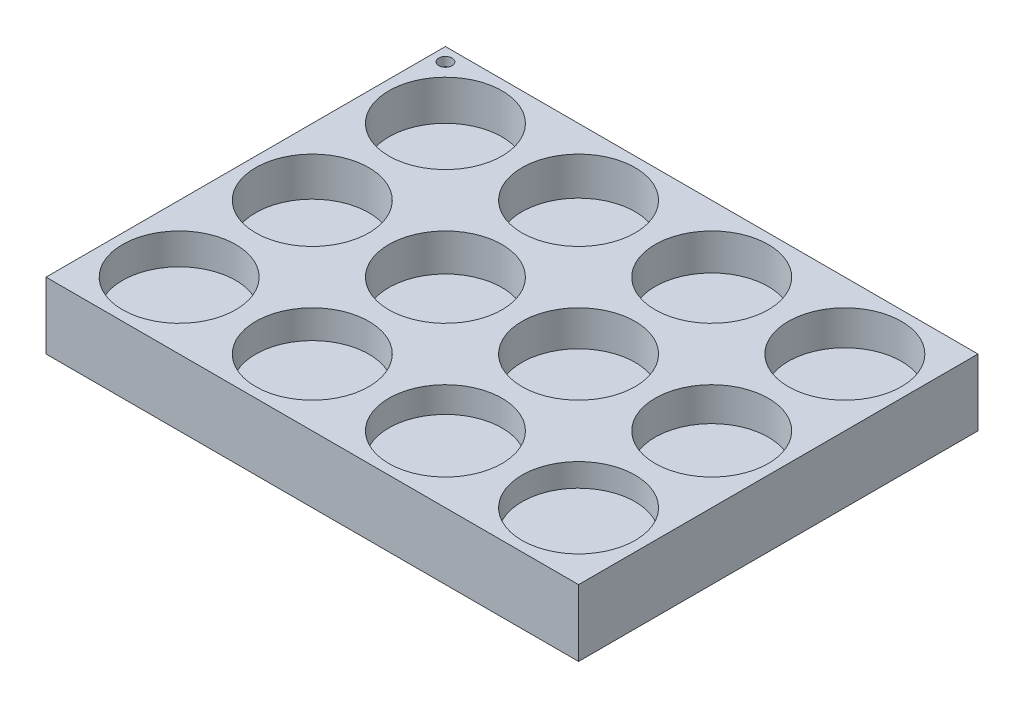
ISO-10303-21;
HEADER;
FILE_DESCRIPTION(('STEP AP214'),'2;1');
FILE_NAME('part.step','',(''),(''),'','','');
FILE_SCHEMA(('AUTOMOTIVE_DESIGN { 1 0 10303 214 1 1 1 1 }'));
ENDSEC;
DATA;
#1=APPLICATION_CONTEXT('core data for automotive mechanical design processes');
#2=APPLICATION_PROTOCOL_DEFINITION('international standard','automotive_design',2000,#1);
#3=PRODUCT_CONTEXT('',#1,'mechanical');
#4=PRODUCT('Part','Part','',(#3));
#5=PRODUCT_RELATED_PRODUCT_CATEGORY('part','',(#4));
#6=PRODUCT_DEFINITION_FORMATION('','',#4);
#7=PRODUCT_DEFINITION_CONTEXT('part definition',#1,'design');
#8=PRODUCT_DEFINITION('design','',#6,#7);
#9=PRODUCT_DEFINITION_SHAPE('','',#8);
#10=(LENGTH_UNIT() NAMED_UNIT(*) SI_UNIT(.MILLI.,.METRE.));
#11=(NAMED_UNIT(*) PLANE_ANGLE_UNIT() SI_UNIT($,.RADIAN.));
#12=(NAMED_UNIT(*) SI_UNIT($,.STERADIAN.) SOLID_ANGLE_UNIT());
#13=UNCERTAINTY_MEASURE_WITH_UNIT(LENGTH_MEASURE(1.E-05),#10,'distance_accuracy_value','');
#14=(GEOMETRIC_REPRESENTATION_CONTEXT(3) GLOBAL_UNCERTAINTY_ASSIGNED_CONTEXT((#13)) GLOBAL_UNIT_ASSIGNED_CONTEXT((#10,
#11,#12)) REPRESENTATION_CONTEXT('',''));
#15=CARTESIAN_POINT('',(0.,0.,0.));
#16=DIRECTION('',(0.,0.,1.));
#17=DIRECTION('',(1.,0.,0.));
#18=AXIS2_PLACEMENT_3D('',#15,#16,#17);
#19=CARTESIAN_POINT('',(0.,0.,0.));
#20=DIRECTION('',(0.,1.,0.));
#21=DIRECTION('',(0.,0.,1.));
#22=AXIS2_PLACEMENT_3D('',#19,#20,#21);
#23=PLANE('',#22);
#24=DIRECTION('',(0.,0.,1.));
#25=VECTOR('',#24,1.);
#26=CARTESIAN_POINT('',(-60.,0.,45.));
#27=LINE('',#26,#25);
#28=CARTESIAN_POINT('',(-60.,0.,-45.));
#29=VERTEX_POINT('',#28);
#30=CARTESIAN_POINT('',(-60.,0.,45.));
#31=VERTEX_POINT('',#30);
#32=EDGE_CURVE('E87',#29,#31,#27,.T.);
#33=ORIENTED_EDGE('',*,*,#32,.F.);
#34=DIRECTION('',(-1.,0.,0.));
#35=VECTOR('',#34,1.);
#36=CARTESIAN_POINT('',(60.,0.,-45.));
#37=LINE('',#36,#35);
#38=CARTESIAN_POINT('',(60.,0.,-45.));
#39=VERTEX_POINT('',#38);
#40=EDGE_CURVE('E56',#39,#29,#37,.T.);
#41=ORIENTED_EDGE('',*,*,#40,.F.);
#42=DIRECTION('',(0.,0.,-1.));
#43=VECTOR('',#42,1.);
#44=CARTESIAN_POINT('',(60.,0.,45.));
#45=LINE('',#44,#43);
#46=CARTESIAN_POINT('',(60.,0.,45.));
#47=VERTEX_POINT('',#46);
#48=EDGE_CURVE('E64',#47,#39,#45,.T.);
#49=ORIENTED_EDGE('',*,*,#48,.F.);
#50=DIRECTION('',(1.,0.,0.));
#51=VECTOR('',#50,1.);
#52=CARTESIAN_POINT('',(60.,0.,45.));
#53=LINE('',#52,#51);
#54=EDGE_CURVE('E183',#31,#47,#53,.T.);
#55=ORIENTED_EDGE('',*,*,#54,.F.);
#56=EDGE_LOOP('',(#33,#41,#49,#55));
#57=FACE_BOUND('',#56,.T.);
#58=CARTESIAN_POINT('',(-45.,0.,-30.));
#59=DIRECTION('',(0.,1.,0.));
#60=DIRECTION('',(0.,0.,1.));
#61=AXIS2_PLACEMENT_3D('',#58,#59,#60);
#62=CIRCLE('',#61,6.65);
#63=CARTESIAN_POINT('',(-45.,0.,-23.35));
#64=VERTEX_POINT('',#63);
#65=EDGE_CURVE('E177',#64,#64,#62,.T.);
#66=ORIENTED_EDGE('',*,*,#65,.T.);
#67=EDGE_LOOP('',(#66));
#68=FACE_BOUND('',#67,.T.);
#69=CARTESIAN_POINT('',(-15.,0.,-30.));
#70=DIRECTION('',(0.,1.,0.));
#71=DIRECTION('',(0.,0.,1.));
#72=AXIS2_PLACEMENT_3D('',#69,#70,#71);
#73=CIRCLE('',#72,6.65);
#74=CARTESIAN_POINT('',(-15.,0.,-23.35));
#75=VERTEX_POINT('',#74);
#76=EDGE_CURVE('E172',#75,#75,#73,.T.);
#77=ORIENTED_EDGE('',*,*,#76,.T.);
#78=EDGE_LOOP('',(#77));
#79=FACE_BOUND('',#78,.T.);
#80=CARTESIAN_POINT('',(15.,0.,-30.));
#81=DIRECTION('',(0.,1.,0.));
#82=DIRECTION('',(0.,0.,1.));
#83=AXIS2_PLACEMENT_3D('',#80,#81,#82);
#84=CIRCLE('',#83,6.65);
#85=CARTESIAN_POINT('',(15.,0.,-23.35));
#86=VERTEX_POINT('',#85);
#87=EDGE_CURVE('E166',#86,#86,#84,.T.);
#88=ORIENTED_EDGE('',*,*,#87,.T.);
#89=EDGE_LOOP('',(#88));
#90=FACE_BOUND('',#89,.T.);
#91=CARTESIAN_POINT('',(45.,0.,-30.));
#92=DIRECTION('',(0.,1.,0.));
#93=DIRECTION('',(0.,0.,1.));
#94=AXIS2_PLACEMENT_3D('',#91,#92,#93);
#95=CIRCLE('',#94,6.65);
#96=CARTESIAN_POINT('',(45.,0.,-23.35));
#97=VERTEX_POINT('',#96);
#98=EDGE_CURVE('E160',#97,#97,#95,.T.);
#99=ORIENTED_EDGE('',*,*,#98,.T.);
#100=EDGE_LOOP('',(#99));
#101=FACE_BOUND('',#100,.T.);
#102=CARTESIAN_POINT('',(-45.,0.,0.));
#103=DIRECTION('',(0.,1.,0.));
#104=DIRECTION('',(0.,0.,1.));
#105=AXIS2_PLACEMENT_3D('',#102,#103,#104);
#106=CIRCLE('',#105,6.65);
#107=CARTESIAN_POINT('',(-45.,0.,6.65000000000001));
#108=VERTEX_POINT('',#107);
#109=EDGE_CURVE('E154',#108,#108,#106,.T.);
#110=ORIENTED_EDGE('',*,*,#109,.T.);
#111=EDGE_LOOP('',(#110));
#112=FACE_BOUND('',#111,.T.);
#113=CARTESIAN_POINT('',(-15.,0.,0.));
#114=DIRECTION('',(0.,1.,0.));
#115=DIRECTION('',(0.,0.,1.));
#116=AXIS2_PLACEMENT_3D('',#113,#114,#115);
#117=CIRCLE('',#116,6.65);
#118=CARTESIAN_POINT('',(-15.,0.,6.65));
#119=VERTEX_POINT('',#118);
#120=EDGE_CURVE('E148',#119,#119,#117,.T.);
#121=ORIENTED_EDGE('',*,*,#120,.T.);
#122=EDGE_LOOP('',(#121));
#123=FACE_BOUND('',#122,.T.);
#124=CARTESIAN_POINT('',(15.,0.,0.));
#125=DIRECTION('',(0.,1.,0.));
#126=DIRECTION('',(0.,0.,1.));
#127=AXIS2_PLACEMENT_3D('',#124,#125,#126);
#128=CIRCLE('',#127,6.65);
#129=CARTESIAN_POINT('',(15.,0.,6.64999999999999));
#130=VERTEX_POINT('',#129);
#131=EDGE_CURVE('E142',#130,#130,#128,.T.);
#132=ORIENTED_EDGE('',*,*,#131,.T.);
#133=EDGE_LOOP('',(#132));
#134=FACE_BOUND('',#133,.T.);
#135=CARTESIAN_POINT('',(45.,0.,0.));
#136=DIRECTION('',(0.,1.,0.));
#137=DIRECTION('',(0.,0.,1.));
#138=AXIS2_PLACEMENT_3D('',#135,#136,#137);
#139=CIRCLE('',#138,6.65);
#140=CARTESIAN_POINT('',(45.,0.,6.65000000000001));
#141=VERTEX_POINT('',#140);
#142=EDGE_CURVE('E136',#141,#141,#139,.T.);
#143=ORIENTED_EDGE('',*,*,#142,.T.);
#144=EDGE_LOOP('',(#143));
#145=FACE_BOUND('',#144,.T.);
#146=CARTESIAN_POINT('',(-45.,0.,30.));
#147=DIRECTION('',(0.,1.,0.));
#148=DIRECTION('',(0.,0.,1.));
#149=AXIS2_PLACEMENT_3D('',#146,#147,#148);
#150=CIRCLE('',#149,6.65);
#151=CARTESIAN_POINT('',(-45.,0.,36.65));
#152=VERTEX_POINT('',#151);
#153=EDGE_CURVE('E130',#152,#152,#150,.T.);
#154=ORIENTED_EDGE('',*,*,#153,.T.);
#155=EDGE_LOOP('',(#154));
#156=FACE_BOUND('',#155,.T.);
#157=CARTESIAN_POINT('',(-15.,0.,30.));
#158=DIRECTION('',(0.,1.,0.));
#159=DIRECTION('',(0.,0.,1.));
#160=AXIS2_PLACEMENT_3D('',#157,#158,#159);
#161=CIRCLE('',#160,6.65);
#162=CARTESIAN_POINT('',(-15.,0.,36.65));
#163=VERTEX_POINT('',#162);
#164=EDGE_CURVE('E124',#163,#163,#161,.T.);
#165=ORIENTED_EDGE('',*,*,#164,.T.);
#166=EDGE_LOOP('',(#165));
#167=FACE_BOUND('',#166,.T.);
#168=CARTESIAN_POINT('',(15.,0.,30.));
#169=DIRECTION('',(0.,1.,0.));
#170=DIRECTION('',(0.,0.,1.));
#171=AXIS2_PLACEMENT_3D('',#168,#169,#170);
#172=CIRCLE('',#171,6.65);
#173=CARTESIAN_POINT('',(15.,0.,36.65));
#174=VERTEX_POINT('',#173);
#175=EDGE_CURVE('E117',#174,#174,#172,.T.);
#176=ORIENTED_EDGE('',*,*,#175,.T.);
#177=EDGE_LOOP('',(#176));
#178=FACE_BOUND('',#177,.T.);
#179=CARTESIAN_POINT('',(45.,0.,30.));
#180=DIRECTION('',(0.,1.,0.));
#181=DIRECTION('',(0.,0.,1.));
#182=AXIS2_PLACEMENT_3D('',#179,#180,#181);
#183=CIRCLE('',#182,6.65);
#184=CARTESIAN_POINT('',(45.,0.,36.65));
#185=VERTEX_POINT('',#184);
#186=EDGE_CURVE('E114',#185,#185,#183,.T.);
#187=ORIENTED_EDGE('',*,*,#186,.T.);
#188=EDGE_LOOP('',(#187));
#189=FACE_BOUND('',#188,.T.);
#190=ADVANCED_FACE('F41',(#57,#68,#79,#90,#101,#112,#123,#134,#145,#156,#167,#178,#189),#23,.F.);
#191=CARTESIAN_POINT('',(-60.,5.,45.));
#192=DIRECTION('',(1.,0.,0.));
#193=DIRECTION('',(0.,0.,-1.));
#194=AXIS2_PLACEMENT_3D('',#191,#192,#193);
#195=PLANE('',#194);
#196=ORIENTED_EDGE('',*,*,#32,.T.);
#197=DIRECTION('',(0.,-1.,0.));
#198=VECTOR('',#197,1.);
#199=CARTESIAN_POINT('',(-60.,5.,45.));
#200=LINE('',#199,#198);
#201=CARTESIAN_POINT('',(-60.,15.,45.));
#202=VERTEX_POINT('',#201);
#203=EDGE_CURVE('E12',#202,#31,#200,.T.);
#204=ORIENTED_EDGE('',*,*,#203,.F.);
#205=DIRECTION('',(0.,0.,1.));
#206=VECTOR('',#205,1.);
#207=CARTESIAN_POINT('',(-60.,15.,-45.));
#208=LINE('',#207,#206);
#209=CARTESIAN_POINT('',(-60.,15.,-45.));
#210=VERTEX_POINT('',#209);
#211=EDGE_CURVE('E85',#210,#202,#208,.T.);
#212=ORIENTED_EDGE('',*,*,#211,.F.);
#213=DIRECTION('',(0.,-1.,0.));
#214=VECTOR('',#213,1.);
#215=CARTESIAN_POINT('',(-60.,5.,-45.));
#216=LINE('',#215,#214);
#217=EDGE_CURVE('E187',#210,#29,#216,.T.);
#218=ORIENTED_EDGE('',*,*,#217,.T.);
#219=EDGE_LOOP('',(#196,#204,#212,#218));
#220=FACE_BOUND('',#219,.T.);
#221=ADVANCED_FACE('F43',(#220),#195,.F.);
#222=CARTESIAN_POINT('',(60.,5.,45.));
#223=DIRECTION('',(0.,0.,-1.));
#224=DIRECTION('',(-1.,0.,0.));
#225=AXIS2_PLACEMENT_3D('',#222,#223,#224);
#226=PLANE('',#225);
#227=ORIENTED_EDGE('',*,*,#54,.T.);
#228=DIRECTION('',(0.,-1.,0.));
#229=VECTOR('',#228,1.);
#230=CARTESIAN_POINT('',(60.,5.,45.));
#231=LINE('',#230,#229);
#232=CARTESIAN_POINT('',(60.,15.,45.));
#233=VERTEX_POINT('',#232);
#234=EDGE_CURVE('E49',#233,#47,#231,.T.);
#235=ORIENTED_EDGE('',*,*,#234,.F.);
#236=DIRECTION('',(1.,0.,0.));
#237=VECTOR('',#236,1.);
#238=CARTESIAN_POINT('',(-60.,15.,45.));
#239=LINE('',#238,#237);
#240=EDGE_CURVE('E90',#202,#233,#239,.T.);
#241=ORIENTED_EDGE('',*,*,#240,.F.);
#242=ORIENTED_EDGE('',*,*,#203,.T.);
#243=EDGE_LOOP('',(#227,#235,#241,#242));
#244=FACE_BOUND('',#243,.T.);
#245=ADVANCED_FACE('F91',(#244),#226,.F.);
#246=CARTESIAN_POINT('',(60.,5.,45.));
#247=DIRECTION('',(-1.,0.,0.));
#248=DIRECTION('',(0.,0.,1.));
#249=AXIS2_PLACEMENT_3D('',#246,#247,#248);
#250=PLANE('',#249);
#251=ORIENTED_EDGE('',*,*,#48,.T.);
#252=DIRECTION('',(0.,-1.,0.));
#253=VECTOR('',#252,1.);
#254=CARTESIAN_POINT('',(60.,5.,-45.));
#255=LINE('',#254,#253);
#256=CARTESIAN_POINT('',(60.,15.,-45.));
#257=VERTEX_POINT('',#256);
#258=EDGE_CURVE('E189',#257,#39,#255,.T.);
#259=ORIENTED_EDGE('',*,*,#258,.F.);
#260=DIRECTION('',(0.,0.,-1.));
#261=VECTOR('',#260,1.);
#262=CARTESIAN_POINT('',(60.,15.,-45.));
#263=LINE('',#262,#261);
#264=EDGE_CURVE('E95',#233,#257,#263,.T.);
#265=ORIENTED_EDGE('',*,*,#264,.F.);
#266=ORIENTED_EDGE('',*,*,#234,.T.);
#267=EDGE_LOOP('',(#251,#259,#265,#266));
#268=FACE_BOUND('',#267,.T.);
#269=ADVANCED_FACE('F190',(#268),#250,.F.);
#270=CARTESIAN_POINT('',(60.,5.,-45.));
#271=DIRECTION('',(0.,0.,1.));
#272=DIRECTION('',(1.,0.,0.));
#273=AXIS2_PLACEMENT_3D('',#270,#271,#272);
#274=PLANE('',#273);
#275=ORIENTED_EDGE('',*,*,#40,.T.);
#276=ORIENTED_EDGE('',*,*,#217,.F.);
#277=DIRECTION('',(-1.,0.,0.));
#278=VECTOR('',#277,1.);
#279=CARTESIAN_POINT('',(-60.,15.,-45.));
#280=LINE('',#279,#278);
#281=EDGE_CURVE('E100',#257,#210,#280,.T.);
#282=ORIENTED_EDGE('',*,*,#281,.F.);
#283=ORIENTED_EDGE('',*,*,#258,.T.);
#284=EDGE_LOOP('',(#275,#276,#282,#283));
#285=FACE_BOUND('',#284,.T.);
#286=ADVANCED_FACE('F275',(#285),#274,.F.);
#287=CARTESIAN_POINT('',(-45.,5.,-30.));
#288=DIRECTION('',(0.,-1.,0.));
#289=DIRECTION('',(0.,0.,-1.));
#290=AXIS2_PLACEMENT_3D('',#287,#288,#289);
#291=CYLINDRICAL_SURFACE('',#290,6.65);
#292=CARTESIAN_POINT('',(-45.,5.,-30.));
#293=DIRECTION('',(0.,1.,0.));
#294=DIRECTION('',(0.,0.,1.));
#295=AXIS2_PLACEMENT_3D('',#292,#293,#294);
#296=CIRCLE('',#295,6.65);
#297=CARTESIAN_POINT('',(-45.,5.,-23.35));
#298=VERTEX_POINT('',#297);
#299=EDGE_CURVE('E169',#298,#298,#296,.T.);
#300=ORIENTED_EDGE('',*,*,#299,.T.);
#301=EDGE_LOOP('',(#300));
#302=FACE_BOUND('',#301,.T.);
#303=ORIENTED_EDGE('',*,*,#65,.F.);
#304=EDGE_LOOP('',(#303));
#305=FACE_BOUND('',#304,.T.);
#306=ADVANCED_FACE('F272',(#302,#305),#291,.F.);
#307=CARTESIAN_POINT('',(-15.,5.,-30.));
#308=DIRECTION('',(0.,-1.,0.));
#309=DIRECTION('',(0.,0.,-1.));
#310=AXIS2_PLACEMENT_3D('',#307,#308,#309);
#311=CYLINDRICAL_SURFACE('',#310,6.65);
#312=CARTESIAN_POINT('',(-15.,5.,-30.));
#313=DIRECTION('',(0.,1.,0.));
#314=DIRECTION('',(0.,0.,1.));
#315=AXIS2_PLACEMENT_3D('',#312,#313,#314);
#316=CIRCLE('',#315,6.65);
#317=CARTESIAN_POINT('',(-15.,5.,-23.35));
#318=VERTEX_POINT('',#317);
#319=EDGE_CURVE('E163',#318,#318,#316,.T.);
#320=ORIENTED_EDGE('',*,*,#319,.T.);
#321=EDGE_LOOP('',(#320));
#322=FACE_BOUND('',#321,.T.);
#323=ORIENTED_EDGE('',*,*,#76,.F.);
#324=EDGE_LOOP('',(#323));
#325=FACE_BOUND('',#324,.T.);
#326=ADVANCED_FACE('F268',(#322,#325),#311,.F.);
#327=CARTESIAN_POINT('',(15.,5.,-30.));
#328=DIRECTION('',(0.,-1.,0.));
#329=DIRECTION('',(0.,0.,-1.));
#330=AXIS2_PLACEMENT_3D('',#327,#328,#329);
#331=CYLINDRICAL_SURFACE('',#330,6.65);
#332=CARTESIAN_POINT('',(15.,5.,-30.));
#333=DIRECTION('',(0.,1.,0.));
#334=DIRECTION('',(0.,0.,1.));
#335=AXIS2_PLACEMENT_3D('',#332,#333,#334);
#336=CIRCLE('',#335,6.65);
#337=CARTESIAN_POINT('',(15.,5.,-23.35));
#338=VERTEX_POINT('',#337);
#339=EDGE_CURVE('E157',#338,#338,#336,.T.);
#340=ORIENTED_EDGE('',*,*,#339,.T.);
#341=EDGE_LOOP('',(#340));
#342=FACE_BOUND('',#341,.T.);
#343=ORIENTED_EDGE('',*,*,#87,.F.);
#344=EDGE_LOOP('',(#343));
#345=FACE_BOUND('',#344,.T.);
#346=ADVANCED_FACE('F264',(#342,#345),#331,.F.);
#347=CARTESIAN_POINT('',(45.,5.,-30.));
#348=DIRECTION('',(0.,-1.,0.));
#349=DIRECTION('',(0.,0.,-1.));
#350=AXIS2_PLACEMENT_3D('',#347,#348,#349);
#351=CYLINDRICAL_SURFACE('',#350,6.65);
#352=CARTESIAN_POINT('',(45.,5.,-30.));
#353=DIRECTION('',(0.,1.,0.));
#354=DIRECTION('',(0.,0.,1.));
#355=AXIS2_PLACEMENT_3D('',#352,#353,#354);
#356=CIRCLE('',#355,6.65);
#357=CARTESIAN_POINT('',(45.,5.,-23.35));
#358=VERTEX_POINT('',#357);
#359=EDGE_CURVE('E151',#358,#358,#356,.T.);
#360=ORIENTED_EDGE('',*,*,#359,.T.);
#361=EDGE_LOOP('',(#360));
#362=FACE_BOUND('',#361,.T.);
#363=ORIENTED_EDGE('',*,*,#98,.F.);
#364=EDGE_LOOP('',(#363));
#365=FACE_BOUND('',#364,.T.);
#366=ADVANCED_FACE('F260',(#362,#365),#351,.F.);
#367=CARTESIAN_POINT('',(-45.,5.,0.));
#368=DIRECTION('',(0.,-1.,0.));
#369=DIRECTION('',(0.,0.,-1.));
#370=AXIS2_PLACEMENT_3D('',#367,#368,#369);
#371=CYLINDRICAL_SURFACE('',#370,6.65);
#372=CARTESIAN_POINT('',(-45.,5.,0.));
#373=DIRECTION('',(0.,1.,0.));
#374=DIRECTION('',(0.,0.,1.));
#375=AXIS2_PLACEMENT_3D('',#372,#373,#374);
#376=CIRCLE('',#375,6.65);
#377=CARTESIAN_POINT('',(-45.,5.,6.65000000000001));
#378=VERTEX_POINT('',#377);
#379=EDGE_CURVE('E145',#378,#378,#376,.T.);
#380=ORIENTED_EDGE('',*,*,#379,.T.);
#381=EDGE_LOOP('',(#380));
#382=FACE_BOUND('',#381,.T.);
#383=ORIENTED_EDGE('',*,*,#109,.F.);
#384=EDGE_LOOP('',(#383));
#385=FACE_BOUND('',#384,.T.);
#386=ADVANCED_FACE('F256',(#382,#385),#371,.F.);
#387=CARTESIAN_POINT('',(-15.,5.,0.));
#388=DIRECTION('',(0.,-1.,0.));
#389=DIRECTION('',(0.,0.,-1.));
#390=AXIS2_PLACEMENT_3D('',#387,#388,#389);
#391=CYLINDRICAL_SURFACE('',#390,6.65);
#392=CARTESIAN_POINT('',(-15.,5.,0.));
#393=DIRECTION('',(0.,1.,0.));
#394=DIRECTION('',(0.,0.,1.));
#395=AXIS2_PLACEMENT_3D('',#392,#393,#394);
#396=CIRCLE('',#395,6.65);
#397=CARTESIAN_POINT('',(-15.,5.,6.65));
#398=VERTEX_POINT('',#397);
#399=EDGE_CURVE('E139',#398,#398,#396,.T.);
#400=ORIENTED_EDGE('',*,*,#399,.T.);
#401=EDGE_LOOP('',(#400));
#402=FACE_BOUND('',#401,.T.);
#403=ORIENTED_EDGE('',*,*,#120,.F.);
#404=EDGE_LOOP('',(#403));
#405=FACE_BOUND('',#404,.T.);
#406=ADVANCED_FACE('F252',(#402,#405),#391,.F.);
#407=CARTESIAN_POINT('',(15.,5.,0.));
#408=DIRECTION('',(0.,-1.,0.));
#409=DIRECTION('',(0.,0.,-1.));
#410=AXIS2_PLACEMENT_3D('',#407,#408,#409);
#411=CYLINDRICAL_SURFACE('',#410,6.65);
#412=CARTESIAN_POINT('',(15.,5.,0.));
#413=DIRECTION('',(0.,1.,0.));
#414=DIRECTION('',(0.,0.,1.));
#415=AXIS2_PLACEMENT_3D('',#412,#413,#414);
#416=CIRCLE('',#415,6.65);
#417=CARTESIAN_POINT('',(15.,5.,6.64999999999999));
#418=VERTEX_POINT('',#417);
#419=EDGE_CURVE('E133',#418,#418,#416,.T.);
#420=ORIENTED_EDGE('',*,*,#419,.T.);
#421=EDGE_LOOP('',(#420));
#422=FACE_BOUND('',#421,.T.);
#423=ORIENTED_EDGE('',*,*,#131,.F.);
#424=EDGE_LOOP('',(#423));
#425=FACE_BOUND('',#424,.T.);
#426=ADVANCED_FACE('F248',(#422,#425),#411,.F.);
#427=CARTESIAN_POINT('',(45.,5.,0.));
#428=DIRECTION('',(0.,-1.,0.));
#429=DIRECTION('',(0.,0.,-1.));
#430=AXIS2_PLACEMENT_3D('',#427,#428,#429);
#431=CYLINDRICAL_SURFACE('',#430,6.65);
#432=CARTESIAN_POINT('',(45.,5.,0.));
#433=DIRECTION('',(0.,1.,0.));
#434=DIRECTION('',(0.,0.,1.));
#435=AXIS2_PLACEMENT_3D('',#432,#433,#434);
#436=CIRCLE('',#435,6.65);
#437=CARTESIAN_POINT('',(45.,5.,6.65000000000001));
#438=VERTEX_POINT('',#437);
#439=EDGE_CURVE('E127',#438,#438,#436,.T.);
#440=ORIENTED_EDGE('',*,*,#439,.T.);
#441=EDGE_LOOP('',(#440));
#442=FACE_BOUND('',#441,.T.);
#443=ORIENTED_EDGE('',*,*,#142,.F.);
#444=EDGE_LOOP('',(#443));
#445=FACE_BOUND('',#444,.T.);
#446=ADVANCED_FACE('F244',(#442,#445),#431,.F.);
#447=CARTESIAN_POINT('',(-45.,5.,30.));
#448=DIRECTION('',(0.,-1.,0.));
#449=DIRECTION('',(0.,0.,-1.));
#450=AXIS2_PLACEMENT_3D('',#447,#448,#449);
#451=CYLINDRICAL_SURFACE('',#450,6.65);
#452=CARTESIAN_POINT('',(-45.,5.,30.));
#453=DIRECTION('',(0.,1.,0.));
#454=DIRECTION('',(0.,0.,1.));
#455=AXIS2_PLACEMENT_3D('',#452,#453,#454);
#456=CIRCLE('',#455,6.65);
#457=CARTESIAN_POINT('',(-45.,5.,36.65));
#458=VERTEX_POINT('',#457);
#459=EDGE_CURVE('E121',#458,#458,#456,.T.);
#460=ORIENTED_EDGE('',*,*,#459,.T.);
#461=EDGE_LOOP('',(#460));
#462=FACE_BOUND('',#461,.T.);
#463=ORIENTED_EDGE('',*,*,#153,.F.);
#464=EDGE_LOOP('',(#463));
#465=FACE_BOUND('',#464,.T.);
#466=ADVANCED_FACE('F240',(#462,#465),#451,.F.);
#467=CARTESIAN_POINT('',(-15.,5.,30.));
#468=DIRECTION('',(0.,-1.,0.));
#469=DIRECTION('',(0.,0.,-1.));
#470=AXIS2_PLACEMENT_3D('',#467,#468,#469);
#471=CYLINDRICAL_SURFACE('',#470,6.65);
#472=CARTESIAN_POINT('',(-15.,5.,30.));
#473=DIRECTION('',(0.,1.,0.));
#474=DIRECTION('',(0.,0.,1.));
#475=AXIS2_PLACEMENT_3D('',#472,#473,#474);
#476=CIRCLE('',#475,6.65);
#477=CARTESIAN_POINT('',(-15.,5.,36.65));
#478=VERTEX_POINT('',#477);
#479=EDGE_CURVE('E113',#478,#478,#476,.T.);
#480=ORIENTED_EDGE('',*,*,#479,.T.);
#481=EDGE_LOOP('',(#480));
#482=FACE_BOUND('',#481,.T.);
#483=ORIENTED_EDGE('',*,*,#164,.F.);
#484=EDGE_LOOP('',(#483));
#485=FACE_BOUND('',#484,.T.);
#486=ADVANCED_FACE('F233',(#482,#485),#471,.F.);
#487=CARTESIAN_POINT('',(15.,5.,30.));
#488=DIRECTION('',(0.,-1.,0.));
#489=DIRECTION('',(0.,0.,-1.));
#490=AXIS2_PLACEMENT_3D('',#487,#488,#489);
#491=CYLINDRICAL_SURFACE('',#490,6.65);
#492=CARTESIAN_POINT('',(15.,5.,30.));
#493=DIRECTION('',(0.,1.,0.));
#494=DIRECTION('',(0.,0.,1.));
#495=AXIS2_PLACEMENT_3D('',#492,#493,#494);
#496=CIRCLE('',#495,6.65);
#497=CARTESIAN_POINT('',(15.,5.,36.65));
#498=VERTEX_POINT('',#497);
#499=EDGE_CURVE('E118',#498,#498,#496,.T.);
#500=ORIENTED_EDGE('',*,*,#499,.T.);
#501=EDGE_LOOP('',(#500));
#502=FACE_BOUND('',#501,.T.);
#503=ORIENTED_EDGE('',*,*,#175,.F.);
#504=EDGE_LOOP('',(#503));
#505=FACE_BOUND('',#504,.T.);
#506=ADVANCED_FACE('F222',(#502,#505),#491,.F.);
#507=CARTESIAN_POINT('',(45.,5.,30.));
#508=DIRECTION('',(0.,-1.,0.));
#509=DIRECTION('',(0.,0.,-1.));
#510=AXIS2_PLACEMENT_3D('',#507,#508,#509);
#511=CYLINDRICAL_SURFACE('',#510,6.65);
#512=CARTESIAN_POINT('',(45.,5.,30.));
#513=DIRECTION('',(0.,1.,0.));
#514=DIRECTION('',(0.,0.,1.));
#515=AXIS2_PLACEMENT_3D('',#512,#513,#514);
#516=CIRCLE('',#515,6.65);
#517=CARTESIAN_POINT('',(45.,5.,36.65));
#518=VERTEX_POINT('',#517);
#519=EDGE_CURVE('E110',#518,#518,#516,.T.);
#520=ORIENTED_EDGE('',*,*,#519,.T.);
#521=EDGE_LOOP('',(#520));
#522=FACE_BOUND('',#521,.T.);
#523=ORIENTED_EDGE('',*,*,#186,.F.);
#524=EDGE_LOOP('',(#523));
#525=FACE_BOUND('',#524,.T.);
#526=ADVANCED_FACE('F219',(#522,#525),#511,.F.);
#527=CARTESIAN_POINT('',(0.,5.,0.));
#528=DIRECTION('',(0.,1.,0.));
#529=DIRECTION('',(0.,0.,1.));
#530=AXIS2_PLACEMENT_3D('',#527,#528,#529);
#531=PLANE('',#530);
#532=ORIENTED_EDGE('',*,*,#519,.F.);
#533=EDGE_LOOP('',(#532));
#534=FACE_BOUND('',#533,.T.);
#535=ADVANCED_FACE('F221',(#534),#531,.F.);
#536=ORIENTED_EDGE('',*,*,#479,.F.);
#537=EDGE_LOOP('',(#536));
#538=FACE_BOUND('',#537,.T.);
#539=ADVANCED_FACE('F229',(#538),#531,.F.);
#540=ORIENTED_EDGE('',*,*,#439,.F.);
#541=EDGE_LOOP('',(#540));
#542=FACE_BOUND('',#541,.T.);
#543=ADVANCED_FACE('F425',(#542),#531,.F.);
#544=ORIENTED_EDGE('',*,*,#399,.F.);
#545=EDGE_LOOP('',(#544));
#546=FACE_BOUND('',#545,.T.);
#547=ADVANCED_FACE('F435',(#546),#531,.F.);
#548=ORIENTED_EDGE('',*,*,#359,.F.);
#549=EDGE_LOOP('',(#548));
#550=FACE_BOUND('',#549,.T.);
#551=ADVANCED_FACE('F445',(#550),#531,.F.);
#552=ORIENTED_EDGE('',*,*,#319,.F.);
#553=EDGE_LOOP('',(#552));
#554=FACE_BOUND('',#553,.T.);
#555=ADVANCED_FACE('F455',(#554),#531,.F.);
#556=ORIENTED_EDGE('',*,*,#299,.F.);
#557=EDGE_LOOP('',(#556));
#558=FACE_BOUND('',#557,.T.);
#559=ADVANCED_FACE('F465',(#558),#531,.F.);
#560=ORIENTED_EDGE('',*,*,#339,.F.);
#561=EDGE_LOOP('',(#560));
#562=FACE_BOUND('',#561,.T.);
#563=ADVANCED_FACE('F475',(#562),#531,.F.);
#564=ORIENTED_EDGE('',*,*,#379,.F.);
#565=EDGE_LOOP('',(#564));
#566=FACE_BOUND('',#565,.T.);
#567=ADVANCED_FACE('F485',(#566),#531,.F.);
#568=ORIENTED_EDGE('',*,*,#419,.F.);
#569=EDGE_LOOP('',(#568));
#570=FACE_BOUND('',#569,.T.);
#571=ADVANCED_FACE('F495',(#570),#531,.F.);
#572=ORIENTED_EDGE('',*,*,#459,.F.);
#573=EDGE_LOOP('',(#572));
#574=FACE_BOUND('',#573,.T.);
#575=ADVANCED_FACE('F505',(#574),#531,.F.);
#576=ORIENTED_EDGE('',*,*,#499,.F.);
#577=EDGE_LOOP('',(#576));
#578=FACE_BOUND('',#577,.T.);
#579=ADVANCED_FACE('F232',(#578),#531,.F.);
#580=CARTESIAN_POINT('',(0.,15.,0.));
#581=DIRECTION('',(0.,1.,0.));
#582=DIRECTION('',(0.,0.,1.));
#583=AXIS2_PLACEMENT_3D('',#580,#581,#582);
#584=PLANE('',#583);
#585=CARTESIAN_POINT('',(-57.0078057300643,15.,-42.0078057300642));
#586=DIRECTION('',(0.,1.,0.));
#587=DIRECTION('',(0.,0.,1.));
#588=AXIS2_PLACEMENT_3D('',#585,#586,#587);
#589=CIRCLE('',#588,1.5);
#590=CARTESIAN_POINT('',(-57.0078057300643,15.,-40.5078057300642));
#591=VERTEX_POINT('',#590);
#592=EDGE_CURVE('E864',#591,#591,#589,.T.);
#593=ORIENTED_EDGE('',*,*,#592,.F.);
#594=EDGE_LOOP('',(#593));
#595=FACE_BOUND('',#594,.T.);
#596=CARTESIAN_POINT('',(45.,15.,30.));
#597=DIRECTION('',(0.,1.,0.));
#598=DIRECTION('',(0.,0.,1.));
#599=AXIS2_PLACEMENT_3D('',#596,#597,#598);
#600=CIRCLE('',#599,12.75);
#601=CARTESIAN_POINT('',(45.,15.,42.75));
#602=VERTEX_POINT('',#601);
#603=EDGE_CURVE('E863',#602,#602,#600,.T.);
#604=ORIENTED_EDGE('',*,*,#603,.F.);
#605=EDGE_LOOP('',(#604));
#606=FACE_BOUND('',#605,.T.);
#607=CARTESIAN_POINT('',(45.,15.,0.));
#608=DIRECTION('',(0.,1.,0.));
#609=DIRECTION('',(0.,0.,1.));
#610=AXIS2_PLACEMENT_3D('',#607,#608,#609);
#611=CIRCLE('',#610,12.75);
#612=CARTESIAN_POINT('',(45.,15.,12.75));
#613=VERTEX_POINT('',#612);
#614=EDGE_CURVE('E874',#613,#613,#611,.T.);
#615=ORIENTED_EDGE('',*,*,#614,.F.);
#616=EDGE_LOOP('',(#615));
#617=FACE_BOUND('',#616,.T.);
#618=CARTESIAN_POINT('',(45.,15.,-30.));
#619=DIRECTION('',(0.,1.,0.));
#620=DIRECTION('',(0.,0.,1.));
#621=AXIS2_PLACEMENT_3D('',#618,#619,#620);
#622=CIRCLE('',#621,12.75);
#623=CARTESIAN_POINT('',(45.,15.,-17.25));
#624=VERTEX_POINT('',#623);
#625=EDGE_CURVE('E880',#624,#624,#622,.T.);
#626=ORIENTED_EDGE('',*,*,#625,.F.);
#627=EDGE_LOOP('',(#626));
#628=FACE_BOUND('',#627,.T.);
#629=CARTESIAN_POINT('',(15.,15.,30.));
#630=DIRECTION('',(0.,1.,0.));
#631=DIRECTION('',(0.,0.,1.));
#632=AXIS2_PLACEMENT_3D('',#629,#630,#631);
#633=CIRCLE('',#632,12.75);
#634=CARTESIAN_POINT('',(15.,15.,42.75));
#635=VERTEX_POINT('',#634);
#636=EDGE_CURVE('E886',#635,#635,#633,.T.);
#637=ORIENTED_EDGE('',*,*,#636,.F.);
#638=EDGE_LOOP('',(#637));
#639=FACE_BOUND('',#638,.T.);
#640=CARTESIAN_POINT('',(15.,15.,0.));
#641=DIRECTION('',(0.,1.,0.));
#642=DIRECTION('',(0.,0.,1.));
#643=AXIS2_PLACEMENT_3D('',#640,#641,#642);
#644=CIRCLE('',#643,12.75);
#645=CARTESIAN_POINT('',(15.,15.,12.75));
#646=VERTEX_POINT('',#645);
#647=EDGE_CURVE('E892',#646,#646,#644,.T.);
#648=ORIENTED_EDGE('',*,*,#647,.F.);
#649=EDGE_LOOP('',(#648));
#650=FACE_BOUND('',#649,.T.);
#651=CARTESIAN_POINT('',(15.,15.,-30.));
#652=DIRECTION('',(0.,1.,0.));
#653=DIRECTION('',(0.,0.,1.));
#654=AXIS2_PLACEMENT_3D('',#651,#652,#653);
#655=CIRCLE('',#654,12.75);
#656=CARTESIAN_POINT('',(15.,15.,-17.25));
#657=VERTEX_POINT('',#656);
#658=EDGE_CURVE('E898',#657,#657,#655,.T.);
#659=ORIENTED_EDGE('',*,*,#658,.F.);
#660=EDGE_LOOP('',(#659));
#661=FACE_BOUND('',#660,.T.);
#662=CARTESIAN_POINT('',(-15.,15.,30.));
#663=DIRECTION('',(0.,1.,0.));
#664=DIRECTION('',(0.,0.,1.));
#665=AXIS2_PLACEMENT_3D('',#662,#663,#664);
#666=CIRCLE('',#665,12.75);
#667=CARTESIAN_POINT('',(-15.,15.,42.75));
#668=VERTEX_POINT('',#667);
#669=EDGE_CURVE('E904',#668,#668,#666,.T.);
#670=ORIENTED_EDGE('',*,*,#669,.F.);
#671=EDGE_LOOP('',(#670));
#672=FACE_BOUND('',#671,.T.);
#673=CARTESIAN_POINT('',(-15.,15.,0.));
#674=DIRECTION('',(0.,1.,0.));
#675=DIRECTION('',(0.,0.,1.));
#676=AXIS2_PLACEMENT_3D('',#673,#674,#675);
#677=CIRCLE('',#676,12.75);
#678=CARTESIAN_POINT('',(-15.,15.,12.75));
#679=VERTEX_POINT('',#678);
#680=EDGE_CURVE('E910',#679,#679,#677,.T.);
#681=ORIENTED_EDGE('',*,*,#680,.F.);
#682=EDGE_LOOP('',(#681));
#683=FACE_BOUND('',#682,.T.);
#684=CARTESIAN_POINT('',(-15.,15.,-30.));
#685=DIRECTION('',(0.,1.,0.));
#686=DIRECTION('',(0.,0.,1.));
#687=AXIS2_PLACEMENT_3D('',#684,#685,#686);
#688=CIRCLE('',#687,12.75);
#689=CARTESIAN_POINT('',(-15.,15.,-17.25));
#690=VERTEX_POINT('',#689);
#691=EDGE_CURVE('E916',#690,#690,#688,.T.);
#692=ORIENTED_EDGE('',*,*,#691,.F.);
#693=EDGE_LOOP('',(#692));
#694=FACE_BOUND('',#693,.T.);
#695=CARTESIAN_POINT('',(-45.,15.,30.));
#696=DIRECTION('',(0.,1.,0.));
#697=DIRECTION('',(0.,0.,1.));
#698=AXIS2_PLACEMENT_3D('',#695,#696,#697);
#699=CIRCLE('',#698,12.75);
#700=CARTESIAN_POINT('',(-45.,15.,42.75));
#701=VERTEX_POINT('',#700);
#702=EDGE_CURVE('E922',#701,#701,#699,.T.);
#703=ORIENTED_EDGE('',*,*,#702,.F.);
#704=EDGE_LOOP('',(#703));
#705=FACE_BOUND('',#704,.T.);
#706=CARTESIAN_POINT('',(-45.,15.,0.));
#707=DIRECTION('',(0.,1.,0.));
#708=DIRECTION('',(0.,0.,1.));
#709=AXIS2_PLACEMENT_3D('',#706,#707,#708);
#710=CIRCLE('',#709,12.75);
#711=CARTESIAN_POINT('',(-45.,15.,12.75));
#712=VERTEX_POINT('',#711);
#713=EDGE_CURVE('E928',#712,#712,#710,.T.);
#714=ORIENTED_EDGE('',*,*,#713,.F.);
#715=EDGE_LOOP('',(#714));
#716=FACE_BOUND('',#715,.T.);
#717=CARTESIAN_POINT('',(-45.,15.,-30.));
#718=DIRECTION('',(0.,1.,0.));
#719=DIRECTION('',(0.,0.,1.));
#720=AXIS2_PLACEMENT_3D('',#717,#718,#719);
#721=CIRCLE('',#720,12.75);
#722=CARTESIAN_POINT('',(-45.,15.,-17.25));
#723=VERTEX_POINT('',#722);
#724=EDGE_CURVE('E104',#723,#723,#721,.T.);
#725=ORIENTED_EDGE('',*,*,#724,.F.);
#726=EDGE_LOOP('',(#725));
#727=FACE_BOUND('',#726,.T.);
#728=ORIENTED_EDGE('',*,*,#211,.T.);
#729=ORIENTED_EDGE('',*,*,#240,.T.);
#730=ORIENTED_EDGE('',*,*,#264,.T.);
#731=ORIENTED_EDGE('',*,*,#281,.T.);
#732=EDGE_LOOP('',(#728,#729,#730,#731));
#733=FACE_BOUND('',#732,.T.);
#734=ADVANCED_FACE('F98',(#595,#606,#617,#628,#639,#650,#661,#672,#683,#694,#705,#716,#727,
#733),#584,.T.);
#735=CARTESIAN_POINT('',(-45.,-31.0624458405139,-30.));
#736=DIRECTION('',(0.,1.,0.));
#737=DIRECTION('',(0.,0.,1.));
#738=AXIS2_PLACEMENT_3D('',#735,#736,#737);
#739=CYLINDRICAL_SURFACE('',#738,12.75);
#740=CARTESIAN_POINT('',(-45.,6.,-30.));
#741=DIRECTION('',(0.,1.,0.));
#742=DIRECTION('',(0.,0.,1.));
#743=AXIS2_PLACEMENT_3D('',#740,#741,#742);
#744=CIRCLE('',#743,12.75);
#745=CARTESIAN_POINT('',(-45.,6.,-17.25));
#746=VERTEX_POINT('',#745);
#747=EDGE_CURVE('E101',#746,#746,#744,.F.);
#748=ORIENTED_EDGE('',*,*,#747,.T.);
#749=EDGE_LOOP('',(#748));
#750=FACE_BOUND('',#749,.T.);
#751=ORIENTED_EDGE('',*,*,#724,.T.);
#752=EDGE_LOOP('',(#751));
#753=FACE_BOUND('',#752,.T.);
#754=ADVANCED_FACE('F534',(#750,#753),#739,.F.);
#755=CARTESIAN_POINT('',(0.,6.,0.));
#756=DIRECTION('',(0.,1.,0.));
#757=DIRECTION('',(0.,0.,1.));
#758=AXIS2_PLACEMENT_3D('',#755,#756,#757);
#759=PLANE('',#758);
#760=ORIENTED_EDGE('',*,*,#747,.F.);
#761=EDGE_LOOP('',(#760));
#762=FACE_BOUND('',#761,.T.);
#763=ADVANCED_FACE('F545',(#762),#759,.T.);
#764=CARTESIAN_POINT('',(-45.,-31.0624458405139,0.));
#765=DIRECTION('',(0.,1.,0.));
#766=DIRECTION('',(0.,0.,1.));
#767=AXIS2_PLACEMENT_3D('',#764,#765,#766);
#768=CYLINDRICAL_SURFACE('',#767,12.75);
#769=CARTESIAN_POINT('',(-45.,6.2,0.));
#770=DIRECTION('',(0.,1.,0.));
#771=DIRECTION('',(0.,0.,1.));
#772=AXIS2_PLACEMENT_3D('',#769,#770,#771);
#773=CIRCLE('',#772,12.75);
#774=CARTESIAN_POINT('',(-45.,6.2,12.75));
#775=VERTEX_POINT('',#774);
#776=EDGE_CURVE('E931',#775,#775,#773,.F.);
#777=ORIENTED_EDGE('',*,*,#776,.T.);
#778=EDGE_LOOP('',(#777));
#779=FACE_BOUND('',#778,.T.);
#780=ORIENTED_EDGE('',*,*,#713,.T.);
#781=EDGE_LOOP('',(#780));
#782=FACE_BOUND('',#781,.T.);
#783=ADVANCED_FACE('F556',(#779,#782),#768,.F.);
#784=CARTESIAN_POINT('',(0.,6.2,0.));
#785=DIRECTION('',(0.,1.,0.));
#786=DIRECTION('',(0.,0.,1.));
#787=AXIS2_PLACEMENT_3D('',#784,#785,#786);
#788=PLANE('',#787);
#789=ORIENTED_EDGE('',*,*,#776,.F.);
#790=EDGE_LOOP('',(#789));
#791=FACE_BOUND('',#790,.T.);
#792=ADVANCED_FACE('F567',(#791),#788,.T.);
#793=CARTESIAN_POINT('',(-45.,-31.0624458405139,30.));
#794=DIRECTION('',(0.,1.,0.));
#795=DIRECTION('',(0.,0.,1.));
#796=AXIS2_PLACEMENT_3D('',#793,#794,#795);
#797=CYLINDRICAL_SURFACE('',#796,12.75);
#798=CARTESIAN_POINT('',(-45.,8.,30.));
#799=DIRECTION('',(0.,1.,0.));
#800=DIRECTION('',(0.,0.,1.));
#801=AXIS2_PLACEMENT_3D('',#798,#799,#800);
#802=CIRCLE('',#801,12.75);
#803=CARTESIAN_POINT('',(-45.,8.,42.75));
#804=VERTEX_POINT('',#803);
#805=EDGE_CURVE('E925',#804,#804,#802,.F.);
#806=ORIENTED_EDGE('',*,*,#805,.T.);
#807=EDGE_LOOP('',(#806));
#808=FACE_BOUND('',#807,.T.);
#809=ORIENTED_EDGE('',*,*,#702,.T.);
#810=EDGE_LOOP('',(#809));
#811=FACE_BOUND('',#810,.T.);
#812=ADVANCED_FACE('F578',(#808,#811),#797,.F.);
#813=CARTESIAN_POINT('',(0.,8.,0.));
#814=DIRECTION('',(0.,1.,0.));
#815=DIRECTION('',(0.,0.,1.));
#816=AXIS2_PLACEMENT_3D('',#813,#814,#815);
#817=PLANE('',#816);
#818=ORIENTED_EDGE('',*,*,#805,.F.);
#819=EDGE_LOOP('',(#818));
#820=FACE_BOUND('',#819,.T.);
#821=ADVANCED_FACE('F589',(#820),#817,.T.);
#822=CARTESIAN_POINT('',(-15.,-31.0624458405139,-30.));
#823=DIRECTION('',(0.,1.,0.));
#824=DIRECTION('',(0.,0.,1.));
#825=AXIS2_PLACEMENT_3D('',#822,#823,#824);
#826=CYLINDRICAL_SURFACE('',#825,12.75);
#827=CARTESIAN_POINT('',(-15.,6.4,-30.));
#828=DIRECTION('',(0.,1.,0.));
#829=DIRECTION('',(0.,0.,1.));
#830=AXIS2_PLACEMENT_3D('',#827,#828,#829);
#831=CIRCLE('',#830,12.75);
#832=CARTESIAN_POINT('',(-15.,6.4,-17.25));
#833=VERTEX_POINT('',#832);
#834=EDGE_CURVE('E919',#833,#833,#831,.F.);
#835=ORIENTED_EDGE('',*,*,#834,.T.);
#836=EDGE_LOOP('',(#835));
#837=FACE_BOUND('',#836,.T.);
#838=ORIENTED_EDGE('',*,*,#691,.T.);
#839=EDGE_LOOP('',(#838));
#840=FACE_BOUND('',#839,.T.);
#841=ADVANCED_FACE('F600',(#837,#840),#826,.F.);
#842=CARTESIAN_POINT('',(0.,6.4,0.));
#843=DIRECTION('',(0.,1.,0.));
#844=DIRECTION('',(0.,0.,1.));
#845=AXIS2_PLACEMENT_3D('',#842,#843,#844);
#846=PLANE('',#845);
#847=ORIENTED_EDGE('',*,*,#834,.F.);
#848=EDGE_LOOP('',(#847));
#849=FACE_BOUND('',#848,.T.);
#850=ADVANCED_FACE('F611',(#849),#846,.T.);
#851=CARTESIAN_POINT('',(-15.,-31.0624458405139,0.));
#852=DIRECTION('',(0.,1.,0.));
#853=DIRECTION('',(0.,0.,1.));
#854=AXIS2_PLACEMENT_3D('',#851,#852,#853);
#855=CYLINDRICAL_SURFACE('',#854,12.75);
#856=CARTESIAN_POINT('',(-15.,6.6,0.));
#857=DIRECTION('',(0.,1.,0.));
#858=DIRECTION('',(0.,0.,1.));
#859=AXIS2_PLACEMENT_3D('',#856,#857,#858);
#860=CIRCLE('',#859,12.75);
#861=CARTESIAN_POINT('',(-15.,6.6,12.75));
#862=VERTEX_POINT('',#861);
#863=EDGE_CURVE('E913',#862,#862,#860,.F.);
#864=ORIENTED_EDGE('',*,*,#863,.T.);
#865=EDGE_LOOP('',(#864));
#866=FACE_BOUND('',#865,.T.);
#867=ORIENTED_EDGE('',*,*,#680,.T.);
#868=EDGE_LOOP('',(#867));
#869=FACE_BOUND('',#868,.T.);
#870=ADVANCED_FACE('F622',(#866,#869),#855,.F.);
#871=CARTESIAN_POINT('',(0.,6.6,0.));
#872=DIRECTION('',(0.,1.,0.));
#873=DIRECTION('',(0.,0.,1.));
#874=AXIS2_PLACEMENT_3D('',#871,#872,#873);
#875=PLANE('',#874);
#876=ORIENTED_EDGE('',*,*,#863,.F.);
#877=EDGE_LOOP('',(#876));
#878=FACE_BOUND('',#877,.T.);
#879=ADVANCED_FACE('F633',(#878),#875,.T.);
#880=CARTESIAN_POINT('',(-15.,-31.0624458405139,30.));
#881=DIRECTION('',(0.,1.,0.));
#882=DIRECTION('',(0.,0.,1.));
#883=AXIS2_PLACEMENT_3D('',#880,#881,#882);
#884=CYLINDRICAL_SURFACE('',#883,12.75);
#885=CARTESIAN_POINT('',(-15.,8.6,30.));
#886=DIRECTION('',(0.,1.,0.));
#887=DIRECTION('',(0.,0.,1.));
#888=AXIS2_PLACEMENT_3D('',#885,#886,#887);
#889=CIRCLE('',#888,12.75);
#890=CARTESIAN_POINT('',(-15.,8.6,42.75));
#891=VERTEX_POINT('',#890);
#892=EDGE_CURVE('E907',#891,#891,#889,.F.);
#893=ORIENTED_EDGE('',*,*,#892,.T.);
#894=EDGE_LOOP('',(#893));
#895=FACE_BOUND('',#894,.T.);
#896=ORIENTED_EDGE('',*,*,#669,.T.);
#897=EDGE_LOOP('',(#896));
#898=FACE_BOUND('',#897,.T.);
#899=ADVANCED_FACE('F644',(#895,#898),#884,.F.);
#900=CARTESIAN_POINT('',(0.,8.6,0.));
#901=DIRECTION('',(0.,1.,0.));
#902=DIRECTION('',(0.,0.,1.));
#903=AXIS2_PLACEMENT_3D('',#900,#901,#902);
#904=PLANE('',#903);
#905=ORIENTED_EDGE('',*,*,#892,.F.);
#906=EDGE_LOOP('',(#905));
#907=FACE_BOUND('',#906,.T.);
#908=ADVANCED_FACE('F655',(#907),#904,.T.);
#909=CARTESIAN_POINT('',(15.,-31.0624458405139,-30.));
#910=DIRECTION('',(0.,1.,0.));
#911=DIRECTION('',(0.,0.,1.));
#912=AXIS2_PLACEMENT_3D('',#909,#910,#911);
#913=CYLINDRICAL_SURFACE('',#912,12.75);
#914=CARTESIAN_POINT('',(15.,6.8,-30.));
#915=DIRECTION('',(0.,1.,0.));
#916=DIRECTION('',(0.,0.,1.));
#917=AXIS2_PLACEMENT_3D('',#914,#915,#916);
#918=CIRCLE('',#917,12.75);
#919=CARTESIAN_POINT('',(15.,6.8,-17.25));
#920=VERTEX_POINT('',#919);
#921=EDGE_CURVE('E901',#920,#920,#918,.F.);
#922=ORIENTED_EDGE('',*,*,#921,.T.);
#923=EDGE_LOOP('',(#922));
#924=FACE_BOUND('',#923,.T.);
#925=ORIENTED_EDGE('',*,*,#658,.T.);
#926=EDGE_LOOP('',(#925));
#927=FACE_BOUND('',#926,.T.);
#928=ADVANCED_FACE('F666',(#924,#927),#913,.F.);
#929=CARTESIAN_POINT('',(0.,6.8,0.));
#930=DIRECTION('',(0.,1.,0.));
#931=DIRECTION('',(0.,0.,1.));
#932=AXIS2_PLACEMENT_3D('',#929,#930,#931);
#933=PLANE('',#932);
#934=ORIENTED_EDGE('',*,*,#921,.F.);
#935=EDGE_LOOP('',(#934));
#936=FACE_BOUND('',#935,.T.);
#937=ADVANCED_FACE('F677',(#936),#933,.T.);
#938=CARTESIAN_POINT('',(15.,-31.0624458405139,0.));
#939=DIRECTION('',(0.,1.,0.));
#940=DIRECTION('',(0.,0.,1.));
#941=AXIS2_PLACEMENT_3D('',#938,#939,#940);
#942=CYLINDRICAL_SURFACE('',#941,12.75);
#943=CARTESIAN_POINT('',(15.,7.,0.));
#944=DIRECTION('',(0.,1.,0.));
#945=DIRECTION('',(0.,0.,1.));
#946=AXIS2_PLACEMENT_3D('',#943,#944,#945);
#947=CIRCLE('',#946,12.75);
#948=CARTESIAN_POINT('',(15.,7.,12.75));
#949=VERTEX_POINT('',#948);
#950=EDGE_CURVE('E895',#949,#949,#947,.F.);
#951=ORIENTED_EDGE('',*,*,#950,.T.);
#952=EDGE_LOOP('',(#951));
#953=FACE_BOUND('',#952,.T.);
#954=ORIENTED_EDGE('',*,*,#647,.T.);
#955=EDGE_LOOP('',(#954));
#956=FACE_BOUND('',#955,.T.);
#957=ADVANCED_FACE('F688',(#953,#956),#942,.F.);
#958=CARTESIAN_POINT('',(0.,7.,0.));
#959=DIRECTION('',(0.,1.,0.));
#960=DIRECTION('',(0.,0.,1.));
#961=AXIS2_PLACEMENT_3D('',#958,#959,#960);
#962=PLANE('',#961);
#963=ORIENTED_EDGE('',*,*,#950,.F.);
#964=EDGE_LOOP('',(#963));
#965=FACE_BOUND('',#964,.T.);
#966=ADVANCED_FACE('F699',(#965),#962,.T.);
#967=CARTESIAN_POINT('',(15.,-31.0624458405139,30.));
#968=DIRECTION('',(0.,1.,0.));
#969=DIRECTION('',(0.,0.,1.));
#970=AXIS2_PLACEMENT_3D('',#967,#968,#969);
#971=CYLINDRICAL_SURFACE('',#970,12.75);
#972=CARTESIAN_POINT('',(15.,9.2,30.));
#973=DIRECTION('',(0.,1.,0.));
#974=DIRECTION('',(0.,0.,1.));
#975=AXIS2_PLACEMENT_3D('',#972,#973,#974);
#976=CIRCLE('',#975,12.75);
#977=CARTESIAN_POINT('',(15.,9.2,42.75));
#978=VERTEX_POINT('',#977);
#979=EDGE_CURVE('E889',#978,#978,#976,.F.);
#980=ORIENTED_EDGE('',*,*,#979,.T.);
#981=EDGE_LOOP('',(#980));
#982=FACE_BOUND('',#981,.T.);
#983=ORIENTED_EDGE('',*,*,#636,.T.);
#984=EDGE_LOOP('',(#983));
#985=FACE_BOUND('',#984,.T.);
#986=ADVANCED_FACE('F710',(#982,#985),#971,.F.);
#987=CARTESIAN_POINT('',(0.,9.2,0.));
#988=DIRECTION('',(0.,1.,0.));
#989=DIRECTION('',(0.,0.,1.));
#990=AXIS2_PLACEMENT_3D('',#987,#988,#989);
#991=PLANE('',#990);
#992=ORIENTED_EDGE('',*,*,#979,.F.);
#993=EDGE_LOOP('',(#992));
#994=FACE_BOUND('',#993,.T.);
#995=ADVANCED_FACE('F721',(#994),#991,.T.);
#996=CARTESIAN_POINT('',(45.,-31.0624458405139,-30.));
#997=DIRECTION('',(0.,1.,0.));
#998=DIRECTION('',(0.,0.,1.));
#999=AXIS2_PLACEMENT_3D('',#996,#997,#998);
#1000=CYLINDRICAL_SURFACE('',#999,12.75);
#1001=CARTESIAN_POINT('',(45.,7.2,-30.));
#1002=DIRECTION('',(0.,1.,0.));
#1003=DIRECTION('',(0.,0.,1.));
#1004=AXIS2_PLACEMENT_3D('',#1001,#1002,#1003);
#1005=CIRCLE('',#1004,12.75);
#1006=CARTESIAN_POINT('',(45.,7.2,-17.25));
#1007=VERTEX_POINT('',#1006);
#1008=EDGE_CURVE('E883',#1007,#1007,#1005,.F.);
#1009=ORIENTED_EDGE('',*,*,#1008,.T.);
#1010=EDGE_LOOP('',(#1009));
#1011=FACE_BOUND('',#1010,.T.);
#1012=ORIENTED_EDGE('',*,*,#625,.T.);
#1013=EDGE_LOOP('',(#1012));
#1014=FACE_BOUND('',#1013,.T.);
#1015=ADVANCED_FACE('F732',(#1011,#1014),#1000,.F.);
#1016=CARTESIAN_POINT('',(0.,7.2,0.));
#1017=DIRECTION('',(0.,1.,0.));
#1018=DIRECTION('',(0.,0.,1.));
#1019=AXIS2_PLACEMENT_3D('',#1016,#1017,#1018);
#1020=PLANE('',#1019);
#1021=ORIENTED_EDGE('',*,*,#1008,.F.);
#1022=EDGE_LOOP('',(#1021));
#1023=FACE_BOUND('',#1022,.T.);
#1024=ADVANCED_FACE('F743',(#1023),#1020,.T.);
#1025=CARTESIAN_POINT('',(45.,-31.0624458405139,0.));
#1026=DIRECTION('',(0.,1.,0.));
#1027=DIRECTION('',(0.,0.,1.));
#1028=AXIS2_PLACEMENT_3D('',#1025,#1026,#1027);
#1029=CYLINDRICAL_SURFACE('',#1028,12.75);
#1030=CARTESIAN_POINT('',(45.,7.4,0.));
#1031=DIRECTION('',(0.,1.,0.));
#1032=DIRECTION('',(0.,0.,1.));
#1033=AXIS2_PLACEMENT_3D('',#1030,#1031,#1032);
#1034=CIRCLE('',#1033,12.75);
#1035=CARTESIAN_POINT('',(45.,7.4,12.75));
#1036=VERTEX_POINT('',#1035);
#1037=EDGE_CURVE('E877',#1036,#1036,#1034,.F.);
#1038=ORIENTED_EDGE('',*,*,#1037,.T.);
#1039=EDGE_LOOP('',(#1038));
#1040=FACE_BOUND('',#1039,.T.);
#1041=ORIENTED_EDGE('',*,*,#614,.T.);
#1042=EDGE_LOOP('',(#1041));
#1043=FACE_BOUND('',#1042,.T.);
#1044=ADVANCED_FACE('F754',(#1040,#1043),#1029,.F.);
#1045=CARTESIAN_POINT('',(0.,7.4,0.));
#1046=DIRECTION('',(0.,1.,0.));
#1047=DIRECTION('',(0.,0.,1.));
#1048=AXIS2_PLACEMENT_3D('',#1045,#1046,#1047);
#1049=PLANE('',#1048);
#1050=ORIENTED_EDGE('',*,*,#1037,.F.);
#1051=EDGE_LOOP('',(#1050));
#1052=FACE_BOUND('',#1051,.T.);
#1053=ADVANCED_FACE('F765',(#1052),#1049,.T.);
#1054=CARTESIAN_POINT('',(45.,-31.0624458405139,30.));
#1055=DIRECTION('',(0.,1.,0.));
#1056=DIRECTION('',(0.,0.,1.));
#1057=AXIS2_PLACEMENT_3D('',#1054,#1055,#1056);
#1058=CYLINDRICAL_SURFACE('',#1057,12.75);
#1059=CARTESIAN_POINT('',(45.,9.8,30.));
#1060=DIRECTION('',(0.,1.,0.));
#1061=DIRECTION('',(0.,0.,1.));
#1062=AXIS2_PLACEMENT_3D('',#1059,#1060,#1061);
#1063=CIRCLE('',#1062,12.75);
#1064=CARTESIAN_POINT('',(45.,9.8,42.75));
#1065=VERTEX_POINT('',#1064);
#1066=EDGE_CURVE('E867',#1065,#1065,#1063,.F.);
#1067=ORIENTED_EDGE('',*,*,#1066,.T.);
#1068=EDGE_LOOP('',(#1067));
#1069=FACE_BOUND('',#1068,.T.);
#1070=ORIENTED_EDGE('',*,*,#603,.T.);
#1071=EDGE_LOOP('',(#1070));
#1072=FACE_BOUND('',#1071,.T.);
#1073=ADVANCED_FACE('F776',(#1069,#1072),#1058,.F.);
#1074=CARTESIAN_POINT('',(0.,9.8,0.));
#1075=DIRECTION('',(0.,1.,0.));
#1076=DIRECTION('',(0.,0.,1.));
#1077=AXIS2_PLACEMENT_3D('',#1074,#1075,#1076);
#1078=PLANE('',#1077);
#1079=ORIENTED_EDGE('',*,*,#1066,.F.);
#1080=EDGE_LOOP('',(#1079));
#1081=FACE_BOUND('',#1080,.T.);
#1082=ADVANCED_FACE('F787',(#1081),#1078,.T.);
#1083=CARTESIAN_POINT('',(-57.0078057300643,13.,-42.0078057300642));
#1084=DIRECTION('',(0.,1.,0.));
#1085=DIRECTION('',(0.,0.,1.));
#1086=AXIS2_PLACEMENT_3D('',#1083,#1084,#1085);
#1087=CYLINDRICAL_SURFACE('',#1086,1.5);
#1088=CARTESIAN_POINT('',(-57.0078057300643,13.,-42.0078057300642));
#1089=DIRECTION('',(0.,1.,0.));
#1090=DIRECTION('',(0.,0.,1.));
#1091=AXIS2_PLACEMENT_3D('',#1088,#1089,#1090);
#1092=CIRCLE('',#1091,1.5);
#1093=CARTESIAN_POINT('',(-57.0078057300643,13.,-40.5078057300642));
#1094=VERTEX_POINT('',#1093);
#1095=EDGE_CURVE('E862',#1094,#1094,#1092,.T.);
#1096=ORIENTED_EDGE('',*,*,#1095,.F.);
#1097=EDGE_LOOP('',(#1096));
#1098=FACE_BOUND('',#1097,.T.);
#1099=ORIENTED_EDGE('',*,*,#592,.T.);
#1100=EDGE_LOOP('',(#1099));
#1101=FACE_BOUND('',#1100,.T.);
#1102=ADVANCED_FACE('F797',(#1098,#1101),#1087,.F.);
#1103=CARTESIAN_POINT('',(-57.0078057300643,13.,-42.0078057300642));
#1104=DIRECTION('',(0.,1.,0.));
#1105=DIRECTION('',(0.,0.,1.));
#1106=AXIS2_PLACEMENT_3D('',#1103,#1104,#1105);
#1107=PLANE('',#1106);
#1108=ORIENTED_EDGE('',*,*,#1095,.T.);
#1109=EDGE_LOOP('',(#1108));
#1110=FACE_BOUND('',#1109,.T.);
#1111=ADVANCED_FACE('F807',(#1110),#1107,.T.);
#1112=CLOSED_SHELL('',(#190,#221,#245,#269,#286,#306,#326,#346,#366,#386,#406,#426,#446,#466,
#486,#506,#526,#535,#539,#543,#547,#551,#555,#559,#563,#567,#571,#575,#579,#734,#754,#763,#783,
#792,#812,#821,#841,#850,#870,#879,#899,#908,#928,#937,#957,#966,#986,#995,#1015,#1024,#1044,
#1053,#1073,#1082,#1102,#1111));
#1113=MANIFOLD_SOLID_BREP('B2',#1112);
#1114=ADVANCED_BREP_SHAPE_REPRESENTATION('',(#18,#1113),#14);
#1115=SHAPE_DEFINITION_REPRESENTATION(#9,#1114);
ENDSEC;
END-ISO-10303-21;
